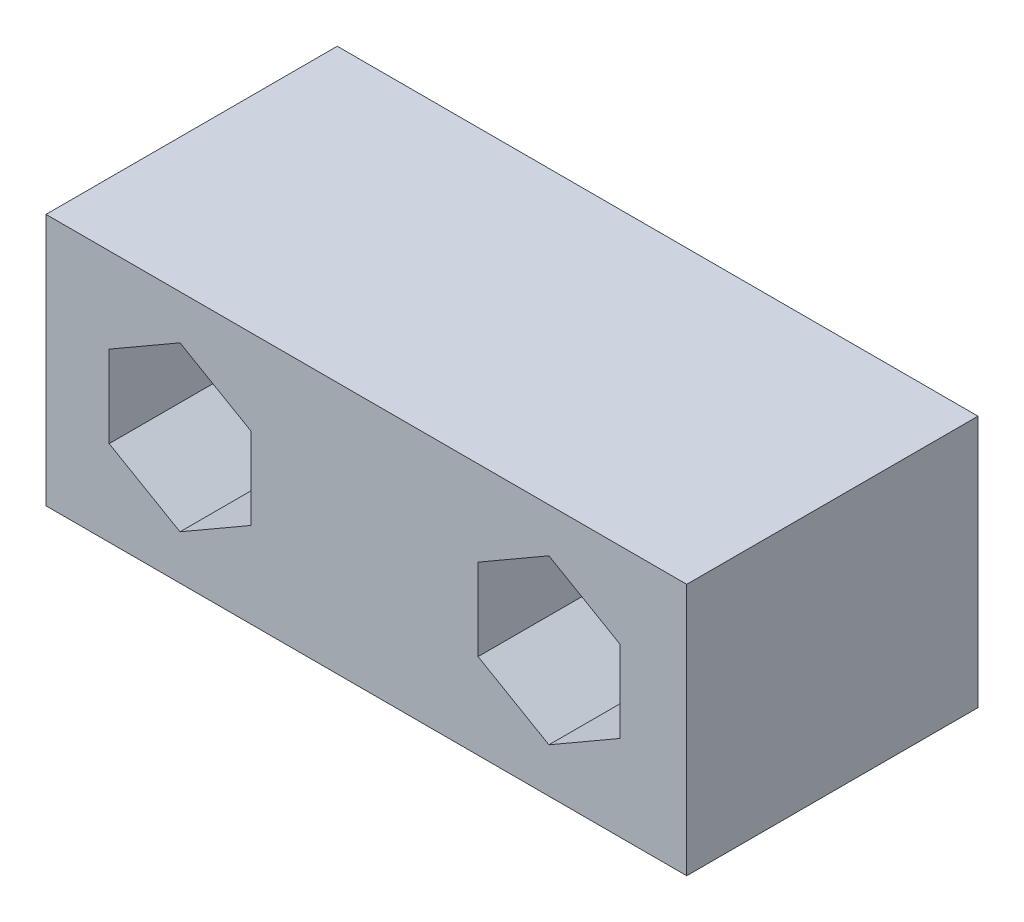
ISO-10303-21;
HEADER;
FILE_DESCRIPTION(('STEP AP214'),'2;1');
FILE_NAME('part.step','',(''),(''),'','','');
FILE_SCHEMA(('AUTOMOTIVE_DESIGN { 1 0 10303 214 1 1 1 1 }'));
ENDSEC;
DATA;
#1=APPLICATION_CONTEXT('core data for automotive mechanical design processes');
#2=APPLICATION_PROTOCOL_DEFINITION('international standard','automotive_design',2000,#1);
#3=PRODUCT_CONTEXT('',#1,'mechanical');
#4=PRODUCT('Part','Part','',(#3));
#5=PRODUCT_RELATED_PRODUCT_CATEGORY('part','',(#4));
#6=PRODUCT_DEFINITION_FORMATION('','',#4);
#7=PRODUCT_DEFINITION_CONTEXT('part definition',#1,'design');
#8=PRODUCT_DEFINITION('design','',#6,#7);
#9=PRODUCT_DEFINITION_SHAPE('','',#8);
#10=(LENGTH_UNIT() NAMED_UNIT(*) SI_UNIT(.MILLI.,.METRE.));
#11=(NAMED_UNIT(*) PLANE_ANGLE_UNIT() SI_UNIT($,.RADIAN.));
#12=(NAMED_UNIT(*) SI_UNIT($,.STERADIAN.) SOLID_ANGLE_UNIT());
#13=UNCERTAINTY_MEASURE_WITH_UNIT(LENGTH_MEASURE(1.E-05),#10,'distance_accuracy_value','');
#14=(GEOMETRIC_REPRESENTATION_CONTEXT(3) GLOBAL_UNCERTAINTY_ASSIGNED_CONTEXT((#13)) GLOBAL_UNIT_ASSIGNED_CONTEXT((#10,
#11,#12)) REPRESENTATION_CONTEXT('',''));
#15=CARTESIAN_POINT('',(0.,0.,0.));
#16=DIRECTION('',(0.,0.,1.));
#17=DIRECTION('',(1.,0.,0.));
#18=AXIS2_PLACEMENT_3D('',#15,#16,#17);
#19=CARTESIAN_POINT('',(-17.9022452868178,6.5,-7.5));
#20=DIRECTION('',(0.,1.,0.));
#21=DIRECTION('',(-1.,0.,0.));
#22=AXIS2_PLACEMENT_3D('',#19,#20,#21);
#23=PLANE('',#22);
#24=DIRECTION('',(-1.,0.,0.));
#25=VECTOR('',#24,1.);
#26=CARTESIAN_POINT('',(-17.9022452868178,6.5,7.5));
#27=LINE('',#26,#25);
#28=CARTESIAN_POINT('',(-17.9022452868178,6.5,7.5));
#29=VERTEX_POINT('',#28);
#30=CARTESIAN_POINT('',(-50.9022452868178,6.50000000000001,7.5));
#31=VERTEX_POINT('',#30);
#32=EDGE_CURVE('E233',#29,#31,#27,.T.);
#33=ORIENTED_EDGE('',*,*,#32,.F.);
#34=DIRECTION('',(0.,0.,1.));
#35=VECTOR('',#34,1.);
#36=CARTESIAN_POINT('',(-17.9022452868178,6.5,-7.5));
#37=LINE('',#36,#35);
#38=CARTESIAN_POINT('',(-17.9022452868178,6.5,-7.5));
#39=VERTEX_POINT('',#38);
#40=EDGE_CURVE('E11',#39,#29,#37,.T.);
#41=ORIENTED_EDGE('',*,*,#40,.F.);
#42=DIRECTION('',(-1.,0.,0.));
#43=VECTOR('',#42,1.);
#44=CARTESIAN_POINT('',(-17.9022452868178,6.5,-7.5));
#45=LINE('',#44,#43);
#46=CARTESIAN_POINT('',(-50.9022452868178,6.50000000000001,-7.5));
#47=VERTEX_POINT('',#46);
#48=EDGE_CURVE('E244',#39,#47,#45,.T.);
#49=ORIENTED_EDGE('',*,*,#48,.T.);
#50=DIRECTION('',(0.,0.,1.));
#51=VECTOR('',#50,1.);
#52=CARTESIAN_POINT('',(-50.9022452868178,6.50000000000001,-7.5));
#53=LINE('',#52,#51);
#54=EDGE_CURVE('E33',#47,#31,#53,.T.);
#55=ORIENTED_EDGE('',*,*,#54,.T.);
#56=EDGE_LOOP('',(#33,#41,#49,#55));
#57=FACE_BOUND('',#56,.T.);
#58=ADVANCED_FACE('F30',(#57),#23,.T.);
#59=CARTESIAN_POINT('',(-17.9022452868178,-6.5,-7.5));
#60=DIRECTION('',(1.,0.,0.));
#61=DIRECTION('',(0.,0.,-1.));
#62=AXIS2_PLACEMENT_3D('',#59,#60,#61);
#63=PLANE('',#62);
#64=DIRECTION('',(0.,1.,0.));
#65=VECTOR('',#64,1.);
#66=CARTESIAN_POINT('',(-17.9022452868178,-6.5,7.5));
#67=LINE('',#66,#65);
#68=CARTESIAN_POINT('',(-17.9022452868178,-6.5,7.5));
#69=VERTEX_POINT('',#68);
#70=EDGE_CURVE('E248',#69,#29,#67,.T.);
#71=ORIENTED_EDGE('',*,*,#70,.F.);
#72=DIRECTION('',(0.,0.,1.));
#73=VECTOR('',#72,1.);
#74=CARTESIAN_POINT('',(-17.9022452868178,-6.5,-7.5));
#75=LINE('',#74,#73);
#76=CARTESIAN_POINT('',(-17.9022452868178,-6.5,-7.5));
#77=VERTEX_POINT('',#76);
#78=EDGE_CURVE('E38',#77,#69,#75,.T.);
#79=ORIENTED_EDGE('',*,*,#78,.F.);
#80=DIRECTION('',(0.,1.,0.));
#81=VECTOR('',#80,1.);
#82=CARTESIAN_POINT('',(-17.9022452868178,-6.5,-7.5));
#83=LINE('',#82,#81);
#84=EDGE_CURVE('E254',#77,#39,#83,.T.);
#85=ORIENTED_EDGE('',*,*,#84,.T.);
#86=ORIENTED_EDGE('',*,*,#40,.T.);
#87=EDGE_LOOP('',(#71,#79,#85,#86));
#88=FACE_BOUND('',#87,.T.);
#89=ADVANCED_FACE('F280',(#88),#63,.T.);
#90=CARTESIAN_POINT('',(-50.9022452868178,-6.50000000000001,-7.5));
#91=DIRECTION('',(0.,-1.,0.));
#92=DIRECTION('',(1.,0.,0.));
#93=AXIS2_PLACEMENT_3D('',#90,#91,#92);
#94=PLANE('',#93);
#95=DIRECTION('',(1.,0.,0.));
#96=VECTOR('',#95,1.);
#97=CARTESIAN_POINT('',(-50.9022452868178,-6.50000000000001,7.5));
#98=LINE('',#97,#96);
#99=CARTESIAN_POINT('',(-50.9022452868178,-6.50000000000001,7.5));
#100=VERTEX_POINT('',#99);
#101=EDGE_CURVE('E262',#100,#69,#98,.T.);
#102=ORIENTED_EDGE('',*,*,#101,.F.);
#103=DIRECTION('',(0.,0.,1.));
#104=VECTOR('',#103,1.);
#105=CARTESIAN_POINT('',(-50.9022452868178,-6.50000000000001,-7.5));
#106=LINE('',#105,#104);
#107=CARTESIAN_POINT('',(-50.9022452868178,-6.50000000000001,-7.5));
#108=VERTEX_POINT('',#107);
#109=EDGE_CURVE('E267',#108,#100,#106,.T.);
#110=ORIENTED_EDGE('',*,*,#109,.F.);
#111=DIRECTION('',(1.,0.,0.));
#112=VECTOR('',#111,1.);
#113=CARTESIAN_POINT('',(-50.9022452868178,-6.50000000000001,-7.5));
#114=LINE('',#113,#112);
#115=EDGE_CURVE('E251',#108,#77,#114,.T.);
#116=ORIENTED_EDGE('',*,*,#115,.T.);
#117=ORIENTED_EDGE('',*,*,#78,.T.);
#118=EDGE_LOOP('',(#102,#110,#116,#117));
#119=FACE_BOUND('',#118,.T.);
#120=ADVANCED_FACE('F285',(#119),#94,.T.);
#121=CARTESIAN_POINT('',(-50.9022452868178,6.50000000000001,-7.5));
#122=DIRECTION('',(-1.,0.,0.));
#123=DIRECTION('',(0.,0.,1.));
#124=AXIS2_PLACEMENT_3D('',#121,#122,#123);
#125=PLANE('',#124);
#126=DIRECTION('',(0.,-1.,0.));
#127=VECTOR('',#126,1.);
#128=CARTESIAN_POINT('',(-50.9022452868178,6.50000000000001,7.5));
#129=LINE('',#128,#127);
#130=EDGE_CURVE('E259',#31,#100,#129,.T.);
#131=ORIENTED_EDGE('',*,*,#130,.F.);
#132=ORIENTED_EDGE('',*,*,#54,.F.);
#133=DIRECTION('',(0.,-1.,0.));
#134=VECTOR('',#133,1.);
#135=CARTESIAN_POINT('',(-50.9022452868178,6.50000000000001,-7.5));
#136=LINE('',#135,#134);
#137=EDGE_CURVE('E247',#47,#108,#136,.T.);
#138=ORIENTED_EDGE('',*,*,#137,.T.);
#139=ORIENTED_EDGE('',*,*,#109,.T.);
#140=EDGE_LOOP('',(#131,#132,#138,#139));
#141=FACE_BOUND('',#140,.T.);
#142=ADVANCED_FACE('F275',(#141),#125,.T.);
#143=CARTESIAN_POINT('',(-50.9022452868178,6.50000000000001,-7.5));
#144=DIRECTION('',(0.,0.,1.));
#145=DIRECTION('',(1.,0.,0.));
#146=AXIS2_PLACEMENT_3D('',#143,#144,#145);
#147=PLANE('',#146);
#148=DIRECTION('',(0.,-1.,0.));
#149=VECTOR('',#148,1.);
#150=CARTESIAN_POINT('',(-28.6499999999999,-2.0991869112468,-7.5));
#151=LINE('',#150,#149);
#152=CARTESIAN_POINT('',(-28.6499999999999,2.11547005383747,-7.5));
#153=VERTEX_POINT('',#152);
#154=CARTESIAN_POINT('',(-28.6499999999999,-2.0991869112468,-7.5));
#155=VERTEX_POINT('',#154);
#156=EDGE_CURVE('E151',#153,#155,#151,.T.);
#157=ORIENTED_EDGE('',*,*,#156,.T.);
#158=DIRECTION('',(0.866025403784439,-0.5,0.));
#159=VECTOR('',#158,1.);
#160=CARTESIAN_POINT('',(-24.9999999999998,-4.20651539378893,-7.5));
#161=LINE('',#160,#159);
#162=CARTESIAN_POINT('',(-24.9999999999998,-4.20651539378893,-7.5));
#163=VERTEX_POINT('',#162);
#164=EDGE_CURVE('E145',#155,#163,#161,.T.);
#165=ORIENTED_EDGE('',*,*,#164,.T.);
#166=DIRECTION('',(0.866025403784439,0.5,0.));
#167=VECTOR('',#166,1.);
#168=CARTESIAN_POINT('',(-21.3500000000002,-2.09918691124702,-7.5));
#169=LINE('',#168,#167);
#170=CARTESIAN_POINT('',(-21.3500000000002,-2.09918691124702,-7.5));
#171=VERTEX_POINT('',#170);
#172=EDGE_CURVE('E154',#163,#171,#169,.T.);
#173=ORIENTED_EDGE('',*,*,#172,.T.);
#174=DIRECTION('',(0.,1.,0.));
#175=VECTOR('',#174,1.);
#176=CARTESIAN_POINT('',(-21.3500000000004,2.11547005383737,-7.5));
#177=LINE('',#176,#175);
#178=CARTESIAN_POINT('',(-21.3500000000004,2.11547005383737,-7.5));
#179=VERTEX_POINT('',#178);
#180=EDGE_CURVE('E46',#171,#179,#177,.T.);
#181=ORIENTED_EDGE('',*,*,#180,.T.);
#182=DIRECTION('',(-0.866025403784439,0.5,0.));
#183=VECTOR('',#182,1.);
#184=CARTESIAN_POINT('',(-25.0000000000002,4.22279853637939,-7.5));
#185=LINE('',#184,#183);
#186=CARTESIAN_POINT('',(-25.0000000000002,4.22279853637939,-7.5));
#187=VERTEX_POINT('',#186);
#188=EDGE_CURVE('E169',#179,#187,#185,.T.);
#189=ORIENTED_EDGE('',*,*,#188,.T.);
#190=DIRECTION('',(-0.866025403784438,-0.500000000000001,0.));
#191=VECTOR('',#190,1.);
#192=CARTESIAN_POINT('',(-28.6499999999999,2.11547005383747,-7.5));
#193=LINE('',#192,#191);
#194=EDGE_CURVE('E172',#187,#153,#193,.T.);
#195=ORIENTED_EDGE('',*,*,#194,.T.);
#196=EDGE_LOOP('',(#157,#165,#173,#181,#189,#195));
#197=FACE_BOUND('',#196,.T.);
#198=DIRECTION('',(0.,-1.,0.));
#199=VECTOR('',#198,1.);
#200=CARTESIAN_POINT('',(-47.6499999999999,-2.09918691124679,-7.5));
#201=LINE('',#200,#199);
#202=CARTESIAN_POINT('',(-47.6499999999998,2.11547005383747,-7.5));
#203=VERTEX_POINT('',#202);
#204=CARTESIAN_POINT('',(-47.6499999999999,-2.09918691124679,-7.5));
#205=VERTEX_POINT('',#204);
#206=EDGE_CURVE('E212',#203,#205,#201,.T.);
#207=ORIENTED_EDGE('',*,*,#206,.T.);
#208=DIRECTION('',(0.866025403784438,-0.5,0.));
#209=VECTOR('',#208,1.);
#210=CARTESIAN_POINT('',(-43.9999999999999,-4.20651539378893,-7.5));
#211=LINE('',#210,#209);
#212=CARTESIAN_POINT('',(-43.9999999999999,-4.20651539378893,-7.5));
#213=VERTEX_POINT('',#212);
#214=EDGE_CURVE('E196',#205,#213,#211,.T.);
#215=ORIENTED_EDGE('',*,*,#214,.T.);
#216=DIRECTION('',(0.866025403784438,0.5,0.));
#217=VECTOR('',#216,1.);
#218=CARTESIAN_POINT('',(-40.3499999999999,-2.0991869112468,-7.5));
#219=LINE('',#218,#217);
#220=CARTESIAN_POINT('',(-40.3499999999999,-2.0991869112468,-7.5));
#221=VERTEX_POINT('',#220);
#222=EDGE_CURVE('E199',#213,#221,#219,.T.);
#223=ORIENTED_EDGE('',*,*,#222,.T.);
#224=DIRECTION('',(-1.36648889528972E-13,1.,0.));
#225=VECTOR('',#224,1.);
#226=CARTESIAN_POINT('',(-40.3500000000004,2.11547005383737,-7.5));
#227=LINE('',#226,#225);
#228=CARTESIAN_POINT('',(-40.3500000000004,2.11547005383737,-7.5));
#229=VERTEX_POINT('',#228);
#230=EDGE_CURVE('E203',#221,#229,#227,.T.);
#231=ORIENTED_EDGE('',*,*,#230,.T.);
#232=DIRECTION('',(-0.866025403784394,0.500000000000078,0.));
#233=VECTOR('',#232,1.);
#234=CARTESIAN_POINT('',(-43.9999999999999,4.22279853637961,-7.5));
#235=LINE('',#234,#233);
#236=CARTESIAN_POINT('',(-43.9999999999999,4.22279853637961,-7.5));
#237=VERTEX_POINT('',#236);
#238=EDGE_CURVE('E206',#229,#237,#235,.T.);
#239=ORIENTED_EDGE('',*,*,#238,.T.);
#240=DIRECTION('',(-0.866025403784439,-0.5,0.));
#241=VECTOR('',#240,1.);
#242=CARTESIAN_POINT('',(-47.6499999999998,2.11547005383747,-7.5));
#243=LINE('',#242,#241);
#244=EDGE_CURVE('E209',#237,#203,#243,.T.);
#245=ORIENTED_EDGE('',*,*,#244,.T.);
#246=EDGE_LOOP('',(#207,#215,#223,#231,#239,#245));
#247=FACE_BOUND('',#246,.T.);
#248=ORIENTED_EDGE('',*,*,#48,.F.);
#249=ORIENTED_EDGE('',*,*,#84,.F.);
#250=ORIENTED_EDGE('',*,*,#115,.F.);
#251=ORIENTED_EDGE('',*,*,#137,.F.);
#252=EDGE_LOOP('',(#248,#249,#250,#251));
#253=FACE_BOUND('',#252,.T.);
#254=ADVANCED_FACE('F158',(#197,#247,#253),#147,.F.);
#255=CARTESIAN_POINT('',(-50.9022452868178,6.50000000000001,7.5));
#256=DIRECTION('',(0.,0.,1.));
#257=DIRECTION('',(1.,0.,0.));
#258=AXIS2_PLACEMENT_3D('',#255,#256,#257);
#259=PLANE('',#258);
#260=DIRECTION('',(0.866025403784439,-0.5,0.));
#261=VECTOR('',#260,1.);
#262=CARTESIAN_POINT('',(-24.9999999999998,-4.20651539378893,7.5));
#263=LINE('',#262,#261);
#264=CARTESIAN_POINT('',(-28.6499999999999,-2.0991869112468,7.5));
#265=VERTEX_POINT('',#264);
#266=CARTESIAN_POINT('',(-24.9999999999998,-4.20651539378893,7.5));
#267=VERTEX_POINT('',#266);
#268=EDGE_CURVE('E54',#265,#267,#263,.T.);
#269=ORIENTED_EDGE('',*,*,#268,.F.);
#270=DIRECTION('',(0.,-1.,0.));
#271=VECTOR('',#270,1.);
#272=CARTESIAN_POINT('',(-28.6499999999999,-2.0991869112468,7.5));
#273=LINE('',#272,#271);
#274=CARTESIAN_POINT('',(-28.6499999999999,2.11547005383747,7.5));
#275=VERTEX_POINT('',#274);
#276=EDGE_CURVE('E162',#275,#265,#273,.T.);
#277=ORIENTED_EDGE('',*,*,#276,.F.);
#278=DIRECTION('',(-0.866025403784438,-0.500000000000001,0.));
#279=VECTOR('',#278,1.);
#280=CARTESIAN_POINT('',(-28.6499999999999,2.11547005383747,7.5));
#281=LINE('',#280,#279);
#282=CARTESIAN_POINT('',(-25.0000000000002,4.22279853637939,7.5));
#283=VERTEX_POINT('',#282);
#284=EDGE_CURVE('E165',#283,#275,#281,.T.);
#285=ORIENTED_EDGE('',*,*,#284,.F.);
#286=DIRECTION('',(-0.866025403784439,0.5,0.));
#287=VECTOR('',#286,1.);
#288=CARTESIAN_POINT('',(-25.0000000000002,4.22279853637939,7.5));
#289=LINE('',#288,#287);
#290=CARTESIAN_POINT('',(-21.3500000000004,2.11547005383737,7.5));
#291=VERTEX_POINT('',#290);
#292=EDGE_CURVE('E181',#291,#283,#289,.T.);
#293=ORIENTED_EDGE('',*,*,#292,.F.);
#294=DIRECTION('',(0.,1.,0.));
#295=VECTOR('',#294,1.);
#296=CARTESIAN_POINT('',(-21.3500000000004,2.11547005383737,7.5));
#297=LINE('',#296,#295);
#298=CARTESIAN_POINT('',(-21.3500000000002,-2.09918691124702,7.5));
#299=VERTEX_POINT('',#298);
#300=EDGE_CURVE('E178',#299,#291,#297,.T.);
#301=ORIENTED_EDGE('',*,*,#300,.F.);
#302=DIRECTION('',(0.866025403784439,0.5,0.));
#303=VECTOR('',#302,1.);
#304=CARTESIAN_POINT('',(-21.3500000000002,-2.09918691124702,7.5));
#305=LINE('',#304,#303);
#306=EDGE_CURVE('E176',#267,#299,#305,.T.);
#307=ORIENTED_EDGE('',*,*,#306,.F.);
#308=EDGE_LOOP('',(#269,#277,#285,#293,#301,#307));
#309=FACE_BOUND('',#308,.T.);
#310=DIRECTION('',(0.866025403784438,-0.5,0.));
#311=VECTOR('',#310,1.);
#312=CARTESIAN_POINT('',(-43.9999999999999,-4.20651539378893,7.5));
#313=LINE('',#312,#311);
#314=CARTESIAN_POINT('',(-47.6499999999999,-2.09918691124679,7.5));
#315=VERTEX_POINT('',#314);
#316=CARTESIAN_POINT('',(-43.9999999999999,-4.20651539378894,7.5));
#317=VERTEX_POINT('',#316);
#318=EDGE_CURVE('E188',#315,#317,#313,.T.);
#319=ORIENTED_EDGE('',*,*,#318,.F.);
#320=DIRECTION('',(0.,-1.,0.));
#321=VECTOR('',#320,1.);
#322=CARTESIAN_POINT('',(-47.6499999999999,-2.09918691124679,7.5));
#323=LINE('',#322,#321);
#324=CARTESIAN_POINT('',(-47.6499999999998,2.11547005383747,7.5));
#325=VERTEX_POINT('',#324);
#326=EDGE_CURVE('E200',#325,#315,#323,.T.);
#327=ORIENTED_EDGE('',*,*,#326,.F.);
#328=DIRECTION('',(-0.866025403784439,-0.5,0.));
#329=VECTOR('',#328,1.);
#330=CARTESIAN_POINT('',(-47.6499999999998,2.11547005383747,7.5));
#331=LINE('',#330,#329);
#332=CARTESIAN_POINT('',(-43.9999999999999,4.22279853637961,7.5));
#333=VERTEX_POINT('',#332);
#334=EDGE_CURVE('E226',#333,#325,#331,.T.);
#335=ORIENTED_EDGE('',*,*,#334,.F.);
#336=DIRECTION('',(-0.866025403784394,0.500000000000078,0.));
#337=VECTOR('',#336,1.);
#338=CARTESIAN_POINT('',(-43.9999999999999,4.22279853637961,7.5));
#339=LINE('',#338,#337);
#340=CARTESIAN_POINT('',(-40.3500000000004,2.11547005383737,7.5));
#341=VERTEX_POINT('',#340);
#342=EDGE_CURVE('E223',#341,#333,#339,.T.);
#343=ORIENTED_EDGE('',*,*,#342,.F.);
#344=DIRECTION('',(-1.36648889528972E-13,1.,0.));
#345=VECTOR('',#344,1.);
#346=CARTESIAN_POINT('',(-40.3500000000004,2.11547005383737,7.5));
#347=LINE('',#346,#345);
#348=CARTESIAN_POINT('',(-40.3499999999999,-2.0991869112468,7.5));
#349=VERTEX_POINT('',#348);
#350=EDGE_CURVE('E220',#349,#341,#347,.T.);
#351=ORIENTED_EDGE('',*,*,#350,.F.);
#352=DIRECTION('',(0.866025403784438,0.5,0.));
#353=VECTOR('',#352,1.);
#354=CARTESIAN_POINT('',(-40.3499999999999,-2.0991869112468,7.5));
#355=LINE('',#354,#353);
#356=EDGE_CURVE('E217',#317,#349,#355,.T.);
#357=ORIENTED_EDGE('',*,*,#356,.F.);
#358=EDGE_LOOP('',(#319,#327,#335,#343,#351,#357));
#359=FACE_BOUND('',#358,.T.);
#360=ORIENTED_EDGE('',*,*,#32,.T.);
#361=ORIENTED_EDGE('',*,*,#130,.T.);
#362=ORIENTED_EDGE('',*,*,#101,.T.);
#363=ORIENTED_EDGE('',*,*,#70,.T.);
#364=EDGE_LOOP('',(#360,#361,#362,#363));
#365=FACE_BOUND('',#364,.T.);
#366=ADVANCED_FACE('F277',(#309,#359,#365),#259,.T.);
#367=CARTESIAN_POINT('',(-43.9999999999999,-4.20651539378893,-7.5));
#368=DIRECTION('',(-0.5,-0.866025403784438,0.));
#369=DIRECTION('',(0.866025403784439,-0.5,0.));
#370=AXIS2_PLACEMENT_3D('',#367,#368,#369);
#371=PLANE('',#370);
#372=ORIENTED_EDGE('',*,*,#318,.T.);
#373=DIRECTION('',(0.,0.,1.));
#374=VECTOR('',#373,1.);
#375=CARTESIAN_POINT('',(-43.9999999999999,-4.20651539378893,-7.5));
#376=LINE('',#375,#374);
#377=EDGE_CURVE('E215',#213,#317,#376,.T.);
#378=ORIENTED_EDGE('',*,*,#377,.F.);
#379=ORIENTED_EDGE('',*,*,#214,.F.);
#380=DIRECTION('',(0.,0.,1.));
#381=VECTOR('',#380,1.);
#382=CARTESIAN_POINT('',(-47.6499999999999,-2.09918691124679,-7.5));
#383=LINE('',#382,#381);
#384=EDGE_CURVE('E231',#205,#315,#383,.T.);
#385=ORIENTED_EDGE('',*,*,#384,.T.);
#386=EDGE_LOOP('',(#372,#378,#379,#385));
#387=FACE_BOUND('',#386,.T.);
#388=ADVANCED_FACE('F327',(#387),#371,.F.);
#389=CARTESIAN_POINT('',(-47.6499999999999,-2.09918691124679,-7.5));
#390=DIRECTION('',(-1.,0.,0.));
#391=DIRECTION('',(0.,-1.,0.));
#392=AXIS2_PLACEMENT_3D('',#389,#390,#391);
#393=PLANE('',#392);
#394=ORIENTED_EDGE('',*,*,#326,.T.);
#395=ORIENTED_EDGE('',*,*,#384,.F.);
#396=ORIENTED_EDGE('',*,*,#206,.F.);
#397=DIRECTION('',(0.,0.,1.));
#398=VECTOR('',#397,1.);
#399=CARTESIAN_POINT('',(-47.6499999999998,2.11547005383747,-7.5));
#400=LINE('',#399,#398);
#401=EDGE_CURVE('E234',#203,#325,#400,.T.);
#402=ORIENTED_EDGE('',*,*,#401,.T.);
#403=EDGE_LOOP('',(#394,#395,#396,#402));
#404=FACE_BOUND('',#403,.T.);
#405=ADVANCED_FACE('F337',(#404),#393,.F.);
#406=CARTESIAN_POINT('',(-47.6499999999998,2.11547005383747,-7.5));
#407=DIRECTION('',(-0.5,0.866025403784439,0.));
#408=DIRECTION('',(-0.866025403784439,-0.5,0.));
#409=AXIS2_PLACEMENT_3D('',#406,#407,#408);
#410=PLANE('',#409);
#411=ORIENTED_EDGE('',*,*,#334,.T.);
#412=ORIENTED_EDGE('',*,*,#401,.F.);
#413=ORIENTED_EDGE('',*,*,#244,.F.);
#414=DIRECTION('',(0.,0.,1.));
#415=VECTOR('',#414,1.);
#416=CARTESIAN_POINT('',(-43.9999999999999,4.22279853637961,-7.5));
#417=LINE('',#416,#415);
#418=EDGE_CURVE('E236',#237,#333,#417,.T.);
#419=ORIENTED_EDGE('',*,*,#418,.T.);
#420=EDGE_LOOP('',(#411,#412,#413,#419));
#421=FACE_BOUND('',#420,.T.);
#422=ADVANCED_FACE('F347',(#421),#410,.F.);
#423=CARTESIAN_POINT('',(-43.9999999999999,4.22279853637961,-7.5));
#424=DIRECTION('',(0.500000000000078,0.866025403784394,0.));
#425=DIRECTION('',(-0.866025403784394,0.500000000000078,0.));
#426=AXIS2_PLACEMENT_3D('',#423,#424,#425);
#427=PLANE('',#426);
#428=ORIENTED_EDGE('',*,*,#342,.T.);
#429=ORIENTED_EDGE('',*,*,#418,.F.);
#430=ORIENTED_EDGE('',*,*,#238,.F.);
#431=DIRECTION('',(0.,0.,1.));
#432=VECTOR('',#431,1.);
#433=CARTESIAN_POINT('',(-40.3500000000004,2.11547005383737,-7.5));
#434=LINE('',#433,#432);
#435=EDGE_CURVE('E238',#229,#341,#434,.T.);
#436=ORIENTED_EDGE('',*,*,#435,.T.);
#437=EDGE_LOOP('',(#428,#429,#430,#436));
#438=FACE_BOUND('',#437,.T.);
#439=ADVANCED_FACE('F357',(#438),#427,.F.);
#440=CARTESIAN_POINT('',(-40.3500000000004,2.11547005383737,-7.5));
#441=DIRECTION('',(1.,1.36648889528972E-13,0.));
#442=DIRECTION('',(-1.36648889528972E-13,1.,0.));
#443=AXIS2_PLACEMENT_3D('',#440,#441,#442);
#444=PLANE('',#443);
#445=ORIENTED_EDGE('',*,*,#350,.T.);
#446=ORIENTED_EDGE('',*,*,#435,.F.);
#447=ORIENTED_EDGE('',*,*,#230,.F.);
#448=DIRECTION('',(0.,0.,1.));
#449=VECTOR('',#448,1.);
#450=CARTESIAN_POINT('',(-40.3499999999999,-2.0991869112468,-7.5));
#451=LINE('',#450,#449);
#452=EDGE_CURVE('E240',#221,#349,#451,.T.);
#453=ORIENTED_EDGE('',*,*,#452,.T.);
#454=EDGE_LOOP('',(#445,#446,#447,#453));
#455=FACE_BOUND('',#454,.T.);
#456=ADVANCED_FACE('F367',(#455),#444,.F.);
#457=CARTESIAN_POINT('',(-40.3499999999999,-2.0991869112468,-7.5));
#458=DIRECTION('',(0.5,-0.866025403784438,0.));
#459=DIRECTION('',(0.866025403784439,0.5,0.));
#460=AXIS2_PLACEMENT_3D('',#457,#458,#459);
#461=PLANE('',#460);
#462=ORIENTED_EDGE('',*,*,#356,.T.);
#463=ORIENTED_EDGE('',*,*,#452,.F.);
#464=ORIENTED_EDGE('',*,*,#222,.F.);
#465=ORIENTED_EDGE('',*,*,#377,.T.);
#466=EDGE_LOOP('',(#462,#463,#464,#465));
#467=FACE_BOUND('',#466,.T.);
#468=ADVANCED_FACE('F377',(#467),#461,.F.);
#469=CARTESIAN_POINT('',(-24.9999999999998,-4.20651539378893,-7.5));
#470=DIRECTION('',(-0.5,-0.866025403784439,0.));
#471=DIRECTION('',(0.866025403784439,-0.5,0.));
#472=AXIS2_PLACEMENT_3D('',#469,#470,#471);
#473=PLANE('',#472);
#474=ORIENTED_EDGE('',*,*,#268,.T.);
#475=DIRECTION('',(0.,0.,1.));
#476=VECTOR('',#475,1.);
#477=CARTESIAN_POINT('',(-24.9999999999998,-4.20651539378893,-7.5));
#478=LINE('',#477,#476);
#479=EDGE_CURVE('E141',#163,#267,#478,.T.);
#480=ORIENTED_EDGE('',*,*,#479,.F.);
#481=ORIENTED_EDGE('',*,*,#164,.F.);
#482=DIRECTION('',(0.,0.,1.));
#483=VECTOR('',#482,1.);
#484=CARTESIAN_POINT('',(-28.6499999999999,-2.0991869112468,-7.5));
#485=LINE('',#484,#483);
#486=EDGE_CURVE('E186',#155,#265,#485,.T.);
#487=ORIENTED_EDGE('',*,*,#486,.T.);
#488=EDGE_LOOP('',(#474,#480,#481,#487));
#489=FACE_BOUND('',#488,.T.);
#490=ADVANCED_FACE('F143',(#489),#473,.F.);
#491=CARTESIAN_POINT('',(-28.6499999999999,-2.0991869112468,-7.5));
#492=DIRECTION('',(-1.,0.,0.));
#493=DIRECTION('',(0.,-1.,0.));
#494=AXIS2_PLACEMENT_3D('',#491,#492,#493);
#495=PLANE('',#494);
#496=ORIENTED_EDGE('',*,*,#276,.T.);
#497=ORIENTED_EDGE('',*,*,#486,.F.);
#498=ORIENTED_EDGE('',*,*,#156,.F.);
#499=DIRECTION('',(0.,0.,1.));
#500=VECTOR('',#499,1.);
#501=CARTESIAN_POINT('',(-28.6499999999999,2.11547005383747,-7.5));
#502=LINE('',#501,#500);
#503=EDGE_CURVE('E189',#153,#275,#502,.T.);
#504=ORIENTED_EDGE('',*,*,#503,.T.);
#505=EDGE_LOOP('',(#496,#497,#498,#504));
#506=FACE_BOUND('',#505,.T.);
#507=ADVANCED_FACE('F396',(#506),#495,.F.);
#508=CARTESIAN_POINT('',(-28.6499999999999,2.11547005383747,-7.5));
#509=DIRECTION('',(-0.500000000000001,0.866025403784438,0.));
#510=DIRECTION('',(-0.866025403784438,-0.500000000000001,0.));
#511=AXIS2_PLACEMENT_3D('',#508,#509,#510);
#512=PLANE('',#511);
#513=ORIENTED_EDGE('',*,*,#284,.T.);
#514=ORIENTED_EDGE('',*,*,#503,.F.);
#515=ORIENTED_EDGE('',*,*,#194,.F.);
#516=DIRECTION('',(0.,0.,1.));
#517=VECTOR('',#516,1.);
#518=CARTESIAN_POINT('',(-25.0000000000002,4.22279853637939,-7.5));
#519=LINE('',#518,#517);
#520=EDGE_CURVE('E191',#187,#283,#519,.T.);
#521=ORIENTED_EDGE('',*,*,#520,.T.);
#522=EDGE_LOOP('',(#513,#514,#515,#521));
#523=FACE_BOUND('',#522,.T.);
#524=ADVANCED_FACE('F405',(#523),#512,.F.);
#525=CARTESIAN_POINT('',(-25.0000000000002,4.22279853637939,-7.5));
#526=DIRECTION('',(0.5,0.866025403784439,0.));
#527=DIRECTION('',(-0.866025403784439,0.5,0.));
#528=AXIS2_PLACEMENT_3D('',#525,#526,#527);
#529=PLANE('',#528);
#530=ORIENTED_EDGE('',*,*,#292,.T.);
#531=ORIENTED_EDGE('',*,*,#520,.F.);
#532=ORIENTED_EDGE('',*,*,#188,.F.);
#533=DIRECTION('',(0.,0.,1.));
#534=VECTOR('',#533,1.);
#535=CARTESIAN_POINT('',(-21.3500000000004,2.11547005383737,-7.5));
#536=LINE('',#535,#534);
#537=EDGE_CURVE('E193',#179,#291,#536,.T.);
#538=ORIENTED_EDGE('',*,*,#537,.T.);
#539=EDGE_LOOP('',(#530,#531,#532,#538));
#540=FACE_BOUND('',#539,.T.);
#541=ADVANCED_FACE('F415',(#540),#529,.F.);
#542=CARTESIAN_POINT('',(-21.3500000000004,2.11547005383737,-7.5));
#543=DIRECTION('',(1.,0.,0.));
#544=DIRECTION('',(0.,1.,0.));
#545=AXIS2_PLACEMENT_3D('',#542,#543,#544);
#546=PLANE('',#545);
#547=ORIENTED_EDGE('',*,*,#300,.T.);
#548=ORIENTED_EDGE('',*,*,#537,.F.);
#549=ORIENTED_EDGE('',*,*,#180,.F.);
#550=DIRECTION('',(0.,0.,1.));
#551=VECTOR('',#550,1.);
#552=CARTESIAN_POINT('',(-21.3500000000002,-2.09918691124702,-7.5));
#553=LINE('',#552,#551);
#554=EDGE_CURVE('E150',#171,#299,#553,.T.);
#555=ORIENTED_EDGE('',*,*,#554,.T.);
#556=EDGE_LOOP('',(#547,#548,#549,#555));
#557=FACE_BOUND('',#556,.T.);
#558=ADVANCED_FACE('F425',(#557),#546,.F.);
#559=CARTESIAN_POINT('',(-21.3500000000002,-2.09918691124702,-7.5));
#560=DIRECTION('',(0.5,-0.866025403784439,0.));
#561=DIRECTION('',(0.866025403784439,0.5,0.));
#562=AXIS2_PLACEMENT_3D('',#559,#560,#561);
#563=PLANE('',#562);
#564=ORIENTED_EDGE('',*,*,#306,.T.);
#565=ORIENTED_EDGE('',*,*,#554,.F.);
#566=ORIENTED_EDGE('',*,*,#172,.F.);
#567=ORIENTED_EDGE('',*,*,#479,.T.);
#568=EDGE_LOOP('',(#564,#565,#566,#567));
#569=FACE_BOUND('',#568,.T.);
#570=ADVANCED_FACE('F155',(#569),#563,.F.);
#571=CLOSED_SHELL('',(#58,#89,#120,#142,#254,#366,#388,#405,#422,#439,#456,#468,#490,#507,#524,
#541,#558,#570));
#572=MANIFOLD_SOLID_BREP('B2',#571);
#573=ADVANCED_BREP_SHAPE_REPRESENTATION('',(#18,#572),#14);
#574=SHAPE_DEFINITION_REPRESENTATION(#9,#573);
ENDSEC;
END-ISO-10303-21;
